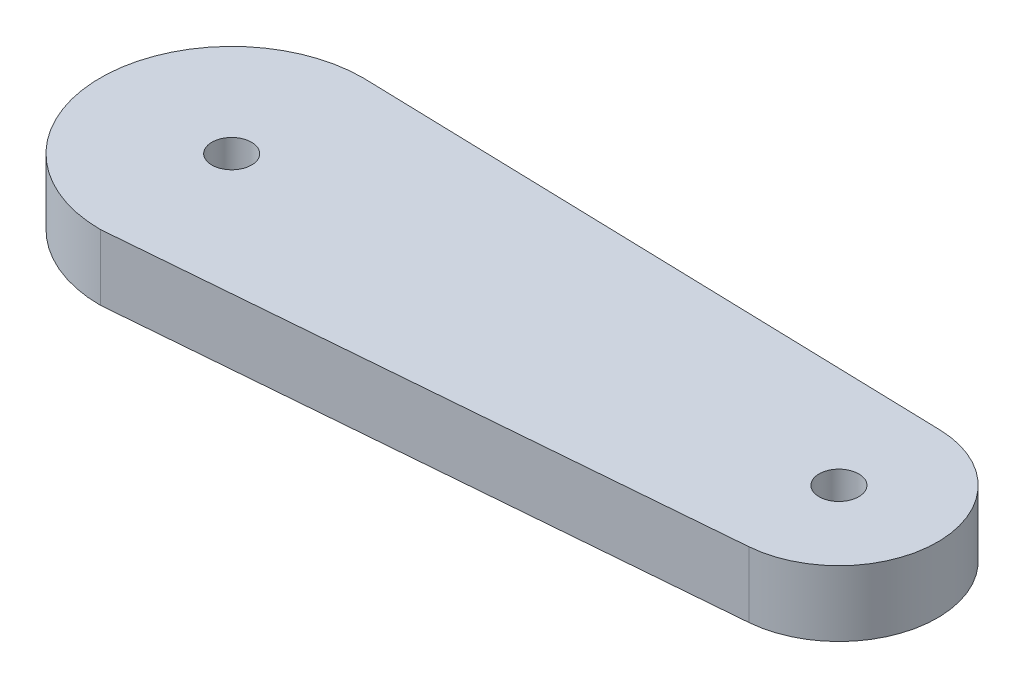
ISO-10303-21;
HEADER;
FILE_DESCRIPTION(('STEP AP214'),'2;1');
FILE_NAME('part.step','',(''),(''),'','','');
FILE_SCHEMA(('AUTOMOTIVE_DESIGN { 1 0 10303 214 1 1 1 1 }'));
ENDSEC;
DATA;
#1=APPLICATION_CONTEXT('core data for automotive mechanical design processes');
#2=APPLICATION_PROTOCOL_DEFINITION('international standard','automotive_design',2000,#1);
#3=PRODUCT_CONTEXT('',#1,'mechanical');
#4=PRODUCT('Part','Part','',(#3));
#5=PRODUCT_RELATED_PRODUCT_CATEGORY('part','',(#4));
#6=PRODUCT_DEFINITION_FORMATION('','',#4);
#7=PRODUCT_DEFINITION_CONTEXT('part definition',#1,'design');
#8=PRODUCT_DEFINITION('design','',#6,#7);
#9=PRODUCT_DEFINITION_SHAPE('','',#8);
#10=(LENGTH_UNIT() NAMED_UNIT(*) SI_UNIT(.MILLI.,.METRE.));
#11=(NAMED_UNIT(*) PLANE_ANGLE_UNIT() SI_UNIT($,.RADIAN.));
#12=(NAMED_UNIT(*) SI_UNIT($,.STERADIAN.) SOLID_ANGLE_UNIT());
#13=UNCERTAINTY_MEASURE_WITH_UNIT(LENGTH_MEASURE(1.E-05),#10,'distance_accuracy_value','');
#14=(GEOMETRIC_REPRESENTATION_CONTEXT(3) GLOBAL_UNCERTAINTY_ASSIGNED_CONTEXT((#13)) GLOBAL_UNIT_ASSIGNED_CONTEXT((#10,
#11,#12)) REPRESENTATION_CONTEXT('',''));
#15=CARTESIAN_POINT('',(0.,0.,0.));
#16=DIRECTION('',(0.,0.,1.));
#17=DIRECTION('',(1.,0.,0.));
#18=AXIS2_PLACEMENT_3D('',#15,#16,#17);
#19=CARTESIAN_POINT('',(0.821566681352623,5.,9.93204097591365));
#20=DIRECTION('',(-0.0824372634712927,0.,-0.996596256059275));
#21=DIRECTION('',(-0.996596256059275,0.,0.0824372634712927));
#22=AXIS2_PLACEMENT_3D('',#19,#20,#21);
#23=PLANE('',#22);
#24=DIRECTION('',(0.996596256059275,0.,-0.0824372634712927));
#25=VECTOR('',#24,1.);
#26=CARTESIAN_POINT('',(0.821566681352623,0.,9.93204097591365));
#27=LINE('',#26,#25);
#28=CARTESIAN_POINT('',(0.,0.,10.));
#29=VERTEX_POINT('',#28);
#30=CARTESIAN_POINT('',(45.6010112062696,0.,6.22793829245028));
#31=VERTEX_POINT('',#30);
#32=EDGE_CURVE('E99',#29,#31,#27,.T.);
#33=ORIENTED_EDGE('',*,*,#32,.T.);
#34=DIRECTION('',(0.,-1.,0.));
#35=VECTOR('',#34,1.);
#36=CARTESIAN_POINT('',(45.6010112062696,5.,6.22793829245028));
#37=LINE('',#36,#35);
#38=CARTESIAN_POINT('',(45.6010112062696,5.,6.22793829245028));
#39=VERTEX_POINT('',#38);
#40=EDGE_CURVE('E11',#39,#31,#37,.T.);
#41=ORIENTED_EDGE('',*,*,#40,.F.);
#42=DIRECTION('',(0.996596256059275,0.,-0.0824372634712927));
#43=VECTOR('',#42,1.);
#44=CARTESIAN_POINT('',(0.821566681352623,5.,9.93204097591365));
#45=LINE('',#44,#43);
#46=CARTESIAN_POINT('',(0.,5.,10.));
#47=VERTEX_POINT('',#46);
#48=EDGE_CURVE('E84',#47,#39,#45,.T.);
#49=ORIENTED_EDGE('',*,*,#48,.F.);
#50=DIRECTION('',(0.,-1.,0.));
#51=VECTOR('',#50,1.);
#52=CARTESIAN_POINT('',(0.,5.,10.));
#53=LINE('',#52,#51);
#54=EDGE_CURVE('E95',#47,#29,#53,.T.);
#55=ORIENTED_EDGE('',*,*,#54,.T.);
#56=EDGE_LOOP('',(#33,#41,#49,#55));
#57=FACE_BOUND('',#56,.T.);
#58=ADVANCED_FACE('F37',(#57),#23,.F.);
#59=CARTESIAN_POINT('',(44.9827317302349,5.,-1.24653362799429));
#60=DIRECTION('',(0.,-1.,0.));
#61=DIRECTION('',(0.,0.,-1.));
#62=AXIS2_PLACEMENT_3D('',#59,#60,#61);
#63=CYLINDRICAL_SURFACE('',#62,7.50000000000001);
#64=CARTESIAN_POINT('',(44.9827317302349,0.,-1.24653362799429));
#65=DIRECTION('',(0.,1.,0.));
#66=DIRECTION('',(0.,0.,1.));
#67=AXIS2_PLACEMENT_3D('',#64,#65,#66);
#68=CIRCLE('',#67,7.50000000000001);
#69=CARTESIAN_POINT('',(45.1911593044558,0.,-8.74363693169128));
#70=VERTEX_POINT('',#69);
#71=EDGE_CURVE('E89',#31,#70,#68,.T.);
#72=ORIENTED_EDGE('',*,*,#71,.T.);
#73=DIRECTION('',(0.,-1.,0.));
#74=VECTOR('',#73,1.);
#75=CARTESIAN_POINT('',(45.1911593044558,5.,-8.74363693169128));
#76=LINE('',#75,#74);
#77=CARTESIAN_POINT('',(45.1911593044558,5.,-8.74363693169128));
#78=VERTEX_POINT('',#77);
#79=EDGE_CURVE('E45',#78,#70,#76,.T.);
#80=ORIENTED_EDGE('',*,*,#79,.F.);
#81=CARTESIAN_POINT('',(44.9827317302349,5.,-1.24653362799429));
#82=DIRECTION('',(0.,1.,0.));
#83=DIRECTION('',(0.,0.,1.));
#84=AXIS2_PLACEMENT_3D('',#81,#82,#83);
#85=CIRCLE('',#84,7.50000000000001);
#86=EDGE_CURVE('E79',#39,#78,#85,.T.);
#87=ORIENTED_EDGE('',*,*,#86,.F.);
#88=ORIENTED_EDGE('',*,*,#40,.T.);
#89=EDGE_LOOP('',(#72,#80,#87,#88));
#90=FACE_BOUND('',#89,.T.);
#91=ADVANCED_FACE('F88',(#90),#63,.T.);
#92=CARTESIAN_POINT('',(0.277796098715276,5.,-9.99227696823189));
#93=DIRECTION('',(0.0277903432294599,0.,-0.999613773826266));
#94=DIRECTION('',(-0.999613773826266,0.,-0.0277903432294599));
#95=AXIS2_PLACEMENT_3D('',#92,#93,#94);
#96=PLANE('',#95);
#97=DIRECTION('',(0.999613773826266,0.,0.0277903432294599));
#98=VECTOR('',#97,1.);
#99=CARTESIAN_POINT('',(0.277796098715276,0.,-9.99227696823189));
#100=LINE('',#99,#98);
#101=CARTESIAN_POINT('',(0.,0.,-10.));
#102=VERTEX_POINT('',#101);
#103=EDGE_CURVE('E104',#102,#70,#100,.T.);
#104=ORIENTED_EDGE('',*,*,#103,.F.);
#105=DIRECTION('',(0.,-1.,0.));
#106=VECTOR('',#105,1.);
#107=CARTESIAN_POINT('',(0.,5.,-10.));
#108=LINE('',#107,#106);
#109=CARTESIAN_POINT('',(0.,5.,-10.));
#110=VERTEX_POINT('',#109);
#111=EDGE_CURVE('E69',#110,#102,#108,.T.);
#112=ORIENTED_EDGE('',*,*,#111,.F.);
#113=DIRECTION('',(0.999613773826266,0.,0.0277903432294599));
#114=VECTOR('',#113,1.);
#115=CARTESIAN_POINT('',(0.277796098715276,5.,-9.99227696823189));
#116=LINE('',#115,#114);
#117=EDGE_CURVE('E82',#110,#78,#116,.T.);
#118=ORIENTED_EDGE('',*,*,#117,.T.);
#119=ORIENTED_EDGE('',*,*,#79,.T.);
#120=EDGE_LOOP('',(#104,#112,#118,#119));
#121=FACE_BOUND('',#120,.T.);
#122=ADVANCED_FACE('F93',(#121),#96,.T.);
#123=CARTESIAN_POINT('',(0.,5.,0.));
#124=DIRECTION('',(0.,-1.,0.));
#125=DIRECTION('',(0.,0.,-1.));
#126=AXIS2_PLACEMENT_3D('',#123,#124,#125);
#127=CYLINDRICAL_SURFACE('',#126,10.);
#128=CARTESIAN_POINT('',(0.,0.,0.));
#129=DIRECTION('',(0.,1.,0.));
#130=DIRECTION('',(0.,0.,1.));
#131=AXIS2_PLACEMENT_3D('',#128,#129,#130);
#132=CIRCLE('',#131,10.);
#133=EDGE_CURVE('E72',#102,#29,#132,.T.);
#134=ORIENTED_EDGE('',*,*,#133,.T.);
#135=ORIENTED_EDGE('',*,*,#54,.F.);
#136=CARTESIAN_POINT('',(0.,5.,0.));
#137=DIRECTION('',(0.,1.,0.));
#138=DIRECTION('',(0.,0.,1.));
#139=AXIS2_PLACEMENT_3D('',#136,#137,#138);
#140=CIRCLE('',#139,10.);
#141=EDGE_CURVE('E53',#110,#47,#140,.T.);
#142=ORIENTED_EDGE('',*,*,#141,.F.);
#143=ORIENTED_EDGE('',*,*,#111,.T.);
#144=EDGE_LOOP('',(#134,#135,#142,#143));
#145=FACE_BOUND('',#144,.T.);
#146=ADVANCED_FACE('F123',(#145),#127,.T.);
#147=CARTESIAN_POINT('',(0.,5.,0.));
#148=DIRECTION('',(0.,1.,0.));
#149=DIRECTION('',(0.,0.,1.));
#150=AXIS2_PLACEMENT_3D('',#147,#148,#149);
#151=PLANE('',#150);
#152=CARTESIAN_POINT('',(0.,5.,0.));
#153=DIRECTION('',(0.,1.,0.));
#154=DIRECTION('',(0.,0.,1.));
#155=AXIS2_PLACEMENT_3D('',#152,#153,#154);
#156=CIRCLE('',#155,1.51);
#157=CARTESIAN_POINT('',(0.,5.,1.51));
#158=VERTEX_POINT('',#157);
#159=EDGE_CURVE('E175',#158,#158,#156,.T.);
#160=ORIENTED_EDGE('',*,*,#159,.F.);
#161=EDGE_LOOP('',(#160));
#162=FACE_BOUND('',#161,.T.);
#163=CARTESIAN_POINT('',(44.9827317302349,5.,-1.24653362799429));
#164=DIRECTION('',(0.,1.,0.));
#165=DIRECTION('',(0.,0.,1.));
#166=AXIS2_PLACEMENT_3D('',#163,#164,#165);
#167=CIRCLE('',#166,1.51);
#168=CARTESIAN_POINT('',(44.9827317302349,5.,0.263466372005712));
#169=VERTEX_POINT('',#168);
#170=EDGE_CURVE('E181',#169,#169,#167,.T.);
#171=ORIENTED_EDGE('',*,*,#170,.F.);
#172=EDGE_LOOP('',(#171));
#173=FACE_BOUND('',#172,.T.);
#174=ORIENTED_EDGE('',*,*,#48,.T.);
#175=ORIENTED_EDGE('',*,*,#86,.T.);
#176=ORIENTED_EDGE('',*,*,#117,.F.);
#177=ORIENTED_EDGE('',*,*,#141,.T.);
#178=EDGE_LOOP('',(#174,#175,#176,#177));
#179=FACE_BOUND('',#178,.T.);
#180=ADVANCED_FACE('F80',(#162,#173,#179),#151,.T.);
#181=CARTESIAN_POINT('',(0.,0.,0.));
#182=DIRECTION('',(0.,1.,0.));
#183=DIRECTION('',(0.,0.,1.));
#184=AXIS2_PLACEMENT_3D('',#181,#182,#183);
#185=PLANE('',#184);
#186=CARTESIAN_POINT('',(0.,0.,0.));
#187=DIRECTION('',(0.,1.,0.));
#188=DIRECTION('',(0.,0.,1.));
#189=AXIS2_PLACEMENT_3D('',#186,#187,#188);
#190=CIRCLE('',#189,1.51);
#191=CARTESIAN_POINT('',(0.,0.,1.51));
#192=VERTEX_POINT('',#191);
#193=EDGE_CURVE('E102',#192,#192,#190,.F.);
#194=ORIENTED_EDGE('',*,*,#193,.F.);
#195=EDGE_LOOP('',(#194));
#196=FACE_BOUND('',#195,.T.);
#197=CARTESIAN_POINT('',(44.9827317302349,0.,-1.24653362799429));
#198=DIRECTION('',(0.,1.,0.));
#199=DIRECTION('',(0.,0.,1.));
#200=AXIS2_PLACEMENT_3D('',#197,#198,#199);
#201=CIRCLE('',#200,1.51);
#202=CARTESIAN_POINT('',(44.9827317302349,0.,0.263466372005712));
#203=VERTEX_POINT('',#202);
#204=EDGE_CURVE('E178',#203,#203,#201,.F.);
#205=ORIENTED_EDGE('',*,*,#204,.F.);
#206=EDGE_LOOP('',(#205));
#207=FACE_BOUND('',#206,.T.);
#208=ORIENTED_EDGE('',*,*,#32,.F.);
#209=ORIENTED_EDGE('',*,*,#133,.F.);
#210=ORIENTED_EDGE('',*,*,#103,.T.);
#211=ORIENTED_EDGE('',*,*,#71,.F.);
#212=EDGE_LOOP('',(#208,#209,#210,#211));
#213=FACE_BOUND('',#212,.T.);
#214=ADVANCED_FACE('F111',(#196,#207,#213),#185,.F.);
#215=CARTESIAN_POINT('',(44.9827317302349,-0.00100000000000013,-1.24653362799429));
#216=DIRECTION('',(0.,1.,0.));
#217=DIRECTION('',(0.,0.,1.));
#218=AXIS2_PLACEMENT_3D('',#215,#216,#217);
#219=CYLINDRICAL_SURFACE('',#218,1.51);
#220=ORIENTED_EDGE('',*,*,#170,.T.);
#221=EDGE_LOOP('',(#220));
#222=FACE_BOUND('',#221,.T.);
#223=ORIENTED_EDGE('',*,*,#204,.T.);
#224=EDGE_LOOP('',(#223));
#225=FACE_BOUND('',#224,.T.);
#226=ADVANCED_FACE('F113',(#222,#225),#219,.F.);
#227=CARTESIAN_POINT('',(0.,-0.00100000000000013,0.));
#228=DIRECTION('',(0.,1.,0.));
#229=DIRECTION('',(0.,0.,1.));
#230=AXIS2_PLACEMENT_3D('',#227,#228,#229);
#231=CYLINDRICAL_SURFACE('',#230,1.51);
#232=ORIENTED_EDGE('',*,*,#159,.T.);
#233=EDGE_LOOP('',(#232));
#234=FACE_BOUND('',#233,.T.);
#235=ORIENTED_EDGE('',*,*,#193,.T.);
#236=EDGE_LOOP('',(#235));
#237=FACE_BOUND('',#236,.T.);
#238=ADVANCED_FACE('F120',(#234,#237),#231,.F.);
#239=CLOSED_SHELL('',(#58,#91,#122,#146,#180,#214,#226,#238));
#240=MANIFOLD_SOLID_BREP('B2',#239);
#241=ADVANCED_BREP_SHAPE_REPRESENTATION('',(#18,#240),#14);
#242=SHAPE_DEFINITION_REPRESENTATION(#9,#241);
ENDSEC;
END-ISO-10303-21;
